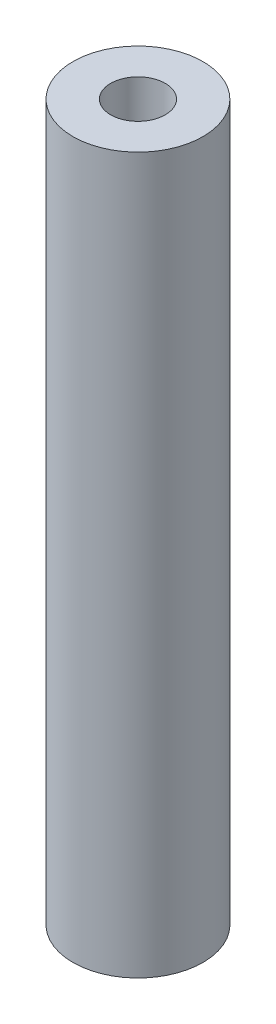
ISO-10303-21;
HEADER;
FILE_DESCRIPTION(('STEP AP214'),'2;1');
FILE_NAME('part.step','',(''),(''),'','','');
FILE_SCHEMA(('AUTOMOTIVE_DESIGN { 1 0 10303 214 1 1 1 1 }'));
ENDSEC;
DATA;
#1=APPLICATION_CONTEXT('core data for automotive mechanical design processes');
#2=APPLICATION_PROTOCOL_DEFINITION('international standard','automotive_design',2000,#1);
#3=PRODUCT_CONTEXT('',#1,'mechanical');
#4=PRODUCT('Part','Part','',(#3));
#5=PRODUCT_RELATED_PRODUCT_CATEGORY('part','',(#4));
#6=PRODUCT_DEFINITION_FORMATION('','',#4);
#7=PRODUCT_DEFINITION_CONTEXT('part definition',#1,'design');
#8=PRODUCT_DEFINITION('design','',#6,#7);
#9=PRODUCT_DEFINITION_SHAPE('','',#8);
#10=(LENGTH_UNIT() NAMED_UNIT(*) SI_UNIT(.MILLI.,.METRE.));
#11=(NAMED_UNIT(*) PLANE_ANGLE_UNIT() SI_UNIT($,.RADIAN.));
#12=(NAMED_UNIT(*) SI_UNIT($,.STERADIAN.) SOLID_ANGLE_UNIT());
#13=UNCERTAINTY_MEASURE_WITH_UNIT(LENGTH_MEASURE(1.E-05),#10,'distance_accuracy_value','');
#14=(GEOMETRIC_REPRESENTATION_CONTEXT(3) GLOBAL_UNCERTAINTY_ASSIGNED_CONTEXT((#13)) GLOBAL_UNIT_ASSIGNED_CONTEXT((#10,
#11,#12)) REPRESENTATION_CONTEXT('',''));
#15=CARTESIAN_POINT('',(0.,0.,0.));
#16=DIRECTION('',(0.,0.,1.));
#17=DIRECTION('',(1.,0.,0.));
#18=AXIS2_PLACEMENT_3D('',#15,#16,#17);
#19=CARTESIAN_POINT('',(0.,69.85,0.));
#20=DIRECTION('',(0.,1.,0.));
#21=DIRECTION('',(0.,0.,1.));
#22=AXIS2_PLACEMENT_3D('',#19,#20,#21);
#23=PLANE('',#22);
#24=CARTESIAN_POINT('',(0.,69.85,0.));
#25=DIRECTION('',(0.,1.,0.));
#26=DIRECTION('',(0.,0.,1.));
#27=AXIS2_PLACEMENT_3D('',#24,#25,#26);
#28=CIRCLE('',#27,6.35);
#29=CARTESIAN_POINT('',(0.,69.85,6.35));
#30=VERTEX_POINT('',#29);
#31=EDGE_CURVE('E10',#30,#30,#28,.T.);
#32=ORIENTED_EDGE('',*,*,#31,.T.);
#33=EDGE_LOOP('',(#32));
#34=FACE_BOUND('',#33,.T.);
#35=CARTESIAN_POINT('',(0.,69.85,0.));
#36=DIRECTION('',(0.,1.,0.));
#37=DIRECTION('',(0.,0.,1.));
#38=AXIS2_PLACEMENT_3D('',#35,#36,#37);
#39=CIRCLE('',#38,2.667);
#40=CARTESIAN_POINT('',(0.,69.85,2.667));
#41=VERTEX_POINT('',#40);
#42=EDGE_CURVE('E46',#41,#41,#39,.T.);
#43=ORIENTED_EDGE('',*,*,#42,.F.);
#44=EDGE_LOOP('',(#43));
#45=FACE_BOUND('',#44,.T.);
#46=ADVANCED_FACE('F35',(#34,#45),#23,.T.);
#47=CARTESIAN_POINT('',(0.,0.,0.));
#48=DIRECTION('',(0.,1.,0.));
#49=DIRECTION('',(0.,0.,1.));
#50=AXIS2_PLACEMENT_3D('',#47,#48,#49);
#51=PLANE('',#50);
#52=CARTESIAN_POINT('',(0.,0.,0.));
#53=DIRECTION('',(0.,1.,0.));
#54=DIRECTION('',(0.,0.,1.));
#55=AXIS2_PLACEMENT_3D('',#52,#53,#54);
#56=CIRCLE('',#55,6.35);
#57=CARTESIAN_POINT('',(0.,0.,6.35));
#58=VERTEX_POINT('',#57);
#59=EDGE_CURVE('E39',#58,#58,#56,.T.);
#60=ORIENTED_EDGE('',*,*,#59,.F.);
#61=EDGE_LOOP('',(#60));
#62=FACE_BOUND('',#61,.T.);
#63=CARTESIAN_POINT('',(0.,0.,0.));
#64=DIRECTION('',(0.,1.,0.));
#65=DIRECTION('',(0.,0.,1.));
#66=AXIS2_PLACEMENT_3D('',#63,#64,#65);
#67=CIRCLE('',#66,2.667);
#68=CARTESIAN_POINT('',(0.,0.,2.667));
#69=VERTEX_POINT('',#68);
#70=EDGE_CURVE('E48',#69,#69,#67,.T.);
#71=ORIENTED_EDGE('',*,*,#70,.T.);
#72=EDGE_LOOP('',(#71));
#73=FACE_BOUND('',#72,.T.);
#74=ADVANCED_FACE('F58',(#62,#73),#51,.F.);
#75=CARTESIAN_POINT('',(0.,69.85,0.));
#76=DIRECTION('',(0.,-1.,0.));
#77=DIRECTION('',(0.,0.,-1.));
#78=AXIS2_PLACEMENT_3D('',#75,#76,#77);
#79=CYLINDRICAL_SURFACE('',#78,6.35);
#80=ORIENTED_EDGE('',*,*,#31,.F.);
#81=EDGE_LOOP('',(#80));
#82=FACE_BOUND('',#81,.T.);
#83=ORIENTED_EDGE('',*,*,#59,.T.);
#84=EDGE_LOOP('',(#83));
#85=FACE_BOUND('',#84,.T.);
#86=ADVANCED_FACE('F37',(#82,#85),#79,.T.);
#87=CARTESIAN_POINT('',(0.,69.85,0.));
#88=DIRECTION('',(0.,-1.,0.));
#89=DIRECTION('',(0.,0.,-1.));
#90=AXIS2_PLACEMENT_3D('',#87,#88,#89);
#91=CYLINDRICAL_SURFACE('',#90,2.667);
#92=ORIENTED_EDGE('',*,*,#42,.T.);
#93=EDGE_LOOP('',(#92));
#94=FACE_BOUND('',#93,.T.);
#95=ORIENTED_EDGE('',*,*,#70,.F.);
#96=EDGE_LOOP('',(#95));
#97=FACE_BOUND('',#96,.T.);
#98=ADVANCED_FACE('F54',(#94,#97),#91,.F.);
#99=CLOSED_SHELL('',(#46,#74,#86,#98));
#100=MANIFOLD_SOLID_BREP('B2',#99);
#101=ADVANCED_BREP_SHAPE_REPRESENTATION('',(#18,#100),#14);
#102=SHAPE_DEFINITION_REPRESENTATION(#9,#101);
ENDSEC;
END-ISO-10303-21;
